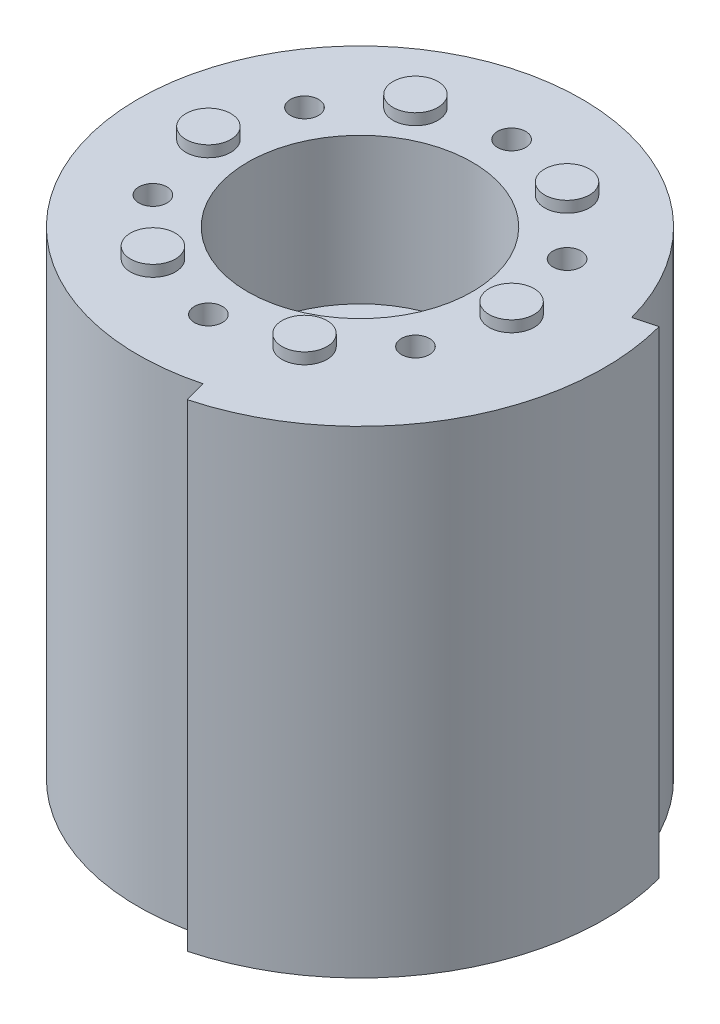
ISO-10303-21;
HEADER;
FILE_DESCRIPTION(('STEP AP214'),'2;1');
FILE_NAME('part.step','',(''),(''),'','','');
FILE_SCHEMA(('AUTOMOTIVE_DESIGN { 1 0 10303 214 1 1 1 1 }'));
ENDSEC;
DATA;
#1=APPLICATION_CONTEXT('core data for automotive mechanical design processes');
#2=APPLICATION_PROTOCOL_DEFINITION('international standard','automotive_design',2000,#1);
#3=PRODUCT_CONTEXT('',#1,'mechanical');
#4=PRODUCT('Part','Part','',(#3));
#5=PRODUCT_RELATED_PRODUCT_CATEGORY('part','',(#4));
#6=PRODUCT_DEFINITION_FORMATION('','',#4);
#7=PRODUCT_DEFINITION_CONTEXT('part definition',#1,'design');
#8=PRODUCT_DEFINITION('design','',#6,#7);
#9=PRODUCT_DEFINITION_SHAPE('','',#8);
#10=(LENGTH_UNIT() NAMED_UNIT(*) SI_UNIT(.MILLI.,.METRE.));
#11=(NAMED_UNIT(*) PLANE_ANGLE_UNIT() SI_UNIT($,.RADIAN.));
#12=(NAMED_UNIT(*) SI_UNIT($,.STERADIAN.) SOLID_ANGLE_UNIT());
#13=UNCERTAINTY_MEASURE_WITH_UNIT(LENGTH_MEASURE(1.E-05),#10,'distance_accuracy_value','');
#14=(GEOMETRIC_REPRESENTATION_CONTEXT(3) GLOBAL_UNCERTAINTY_ASSIGNED_CONTEXT((#13)) GLOBAL_UNIT_ASSIGNED_CONTEXT((#10,
#11,#12)) REPRESENTATION_CONTEXT('',''));
#15=CARTESIAN_POINT('',(0.,0.,0.));
#16=DIRECTION('',(0.,0.,1.));
#17=DIRECTION('',(1.,0.,0.));
#18=AXIS2_PLACEMENT_3D('',#15,#16,#17);
#19=CARTESIAN_POINT('',(0.,1.,0.));
#20=DIRECTION('',(0.,-1.,0.));
#21=DIRECTION('',(0.,0.,-1.));
#22=AXIS2_PLACEMENT_3D('',#19,#20,#21);
#23=CYLINDRICAL_SURFACE('',#22,18.75);
#24=CARTESIAN_POINT('',(0.,1.,0.));
#25=DIRECTION('',(0.,1.,0.));
#26=DIRECTION('',(0.,0.,1.));
#27=AXIS2_PLACEMENT_3D('',#24,#25,#26);
#28=CIRCLE('',#27,18.75);
#29=CARTESIAN_POINT('',(0.,1.,18.75));
#30=VERTEX_POINT('',#29);
#31=EDGE_CURVE('E248',#30,#30,#28,.T.);
#32=ORIENTED_EDGE('',*,*,#31,.T.);
#33=EDGE_LOOP('',(#32));
#34=FACE_BOUND('',#33,.T.);
#35=CARTESIAN_POINT('',(0.,0.25,0.));
#36=DIRECTION('',(0.,-1.,0.));
#37=DIRECTION('',(0.,0.,-1.));
#38=AXIS2_PLACEMENT_3D('',#35,#36,#37);
#39=CIRCLE('',#38,18.75);
#40=CARTESIAN_POINT('',(0.,0.25,-18.75));
#41=VERTEX_POINT('',#40);
#42=EDGE_CURVE('E456',#41,#41,#39,.T.);
#43=ORIENTED_EDGE('',*,*,#42,.T.);
#44=EDGE_LOOP('',(#43));
#45=FACE_BOUND('',#44,.T.);
#46=ADVANCED_FACE('F50',(#34,#45),#23,.F.);
#47=CARTESIAN_POINT('',(-5.99999999999991,0.,10.3923048454133));
#48=DIRECTION('',(0.,1.,0.));
#49=DIRECTION('',(0.,0.,1.));
#50=AXIS2_PLACEMENT_3D('',#47,#48,#49);
#51=CYLINDRICAL_SURFACE('',#50,2.);
#52=CARTESIAN_POINT('',(-5.99999999999991,1.,10.3923048454133));
#53=DIRECTION('',(0.,1.,0.));
#54=DIRECTION('',(0.,0.,1.));
#55=AXIS2_PLACEMENT_3D('',#52,#53,#54);
#56=CIRCLE('',#55,2.);
#57=CARTESIAN_POINT('',(-5.99999999999991,1.,12.3923048454133));
#58=VERTEX_POINT('',#57);
#59=EDGE_CURVE('E254',#58,#58,#56,.F.);
#60=ORIENTED_EDGE('',*,*,#59,.T.);
#61=EDGE_LOOP('',(#60));
#62=FACE_BOUND('',#61,.T.);
#63=CARTESIAN_POINT('',(-5.99999999999991,0.25,10.3923048454133));
#64=DIRECTION('',(0.,-1.,0.));
#65=DIRECTION('',(0.,0.,-1.));
#66=AXIS2_PLACEMENT_3D('',#63,#64,#65);
#67=CIRCLE('',#66,2.);
#68=CARTESIAN_POINT('',(-5.99999999999991,0.25,8.39230484541332));
#69=VERTEX_POINT('',#68);
#70=EDGE_CURVE('E463',#69,#69,#67,.T.);
#71=ORIENTED_EDGE('',*,*,#70,.F.);
#72=EDGE_LOOP('',(#71));
#73=FACE_BOUND('',#72,.T.);
#74=ADVANCED_FACE('F299',(#62,#73),#51,.T.);
#75=CARTESIAN_POINT('',(-6.00000000000005,0.,-10.3923048454132));
#76=DIRECTION('',(0.,1.,0.));
#77=DIRECTION('',(0.,0.,1.));
#78=AXIS2_PLACEMENT_3D('',#75,#76,#77);
#79=CYLINDRICAL_SURFACE('',#78,2.);
#80=CARTESIAN_POINT('',(-6.00000000000005,1.,-10.3923048454132));
#81=DIRECTION('',(0.,1.,0.));
#82=DIRECTION('',(0.,0.,1.));
#83=AXIS2_PLACEMENT_3D('',#80,#81,#82);
#84=CIRCLE('',#83,2.);
#85=CARTESIAN_POINT('',(-6.00000000000005,1.,-8.39230484541324));
#86=VERTEX_POINT('',#85);
#87=EDGE_CURVE('E256',#86,#86,#84,.F.);
#88=ORIENTED_EDGE('',*,*,#87,.T.);
#89=EDGE_LOOP('',(#88));
#90=FACE_BOUND('',#89,.T.);
#91=CARTESIAN_POINT('',(-6.00000000000005,0.25,-10.3923048454132));
#92=DIRECTION('',(0.,-1.,0.));
#93=DIRECTION('',(0.,0.,-1.));
#94=AXIS2_PLACEMENT_3D('',#91,#92,#93);
#95=CIRCLE('',#94,2.);
#96=CARTESIAN_POINT('',(-6.00000000000005,0.25,-12.3923048454132));
#97=VERTEX_POINT('',#96);
#98=EDGE_CURVE('E474',#97,#97,#95,.T.);
#99=ORIENTED_EDGE('',*,*,#98,.F.);
#100=EDGE_LOOP('',(#99));
#101=FACE_BOUND('',#100,.T.);
#102=ADVANCED_FACE('F304',(#90,#101),#79,.T.);
#103=CARTESIAN_POINT('',(12.,0.,0.));
#104=DIRECTION('',(0.,1.,0.));
#105=DIRECTION('',(0.,0.,1.));
#106=AXIS2_PLACEMENT_3D('',#103,#104,#105);
#107=CYLINDRICAL_SURFACE('',#106,2.);
#108=CARTESIAN_POINT('',(12.,1.,0.));
#109=DIRECTION('',(0.,1.,0.));
#110=DIRECTION('',(0.,0.,1.));
#111=AXIS2_PLACEMENT_3D('',#108,#109,#110);
#112=CIRCLE('',#111,2.);
#113=CARTESIAN_POINT('',(12.,1.,2.));
#114=VERTEX_POINT('',#113);
#115=EDGE_CURVE('E57',#114,#114,#112,.F.);
#116=ORIENTED_EDGE('',*,*,#115,.T.);
#117=EDGE_LOOP('',(#116));
#118=FACE_BOUND('',#117,.T.);
#119=CARTESIAN_POINT('',(12.,0.25,0.));
#120=DIRECTION('',(0.,-1.,0.));
#121=DIRECTION('',(0.,0.,-1.));
#122=AXIS2_PLACEMENT_3D('',#119,#120,#121);
#123=CIRCLE('',#122,2.);
#124=CARTESIAN_POINT('',(12.,0.25,-2.));
#125=VERTEX_POINT('',#124);
#126=EDGE_CURVE('E472',#125,#125,#123,.T.);
#127=ORIENTED_EDGE('',*,*,#126,.F.);
#128=EDGE_LOOP('',(#127));
#129=FACE_BOUND('',#128,.T.);
#130=ADVANCED_FACE('F262',(#118,#129),#107,.T.);
#131=CARTESIAN_POINT('',(0.,1.,0.));
#132=DIRECTION('',(0.,1.,0.));
#133=DIRECTION('',(0.,0.,1.));
#134=AXIS2_PLACEMENT_3D('',#131,#132,#133);
#135=PLANE('',#134);
#136=CARTESIAN_POINT('',(-13.5,1.,0.));
#137=DIRECTION('',(0.,-1.,0.));
#138=DIRECTION('',(0.,0.,-1.));
#139=AXIS2_PLACEMENT_3D('',#136,#137,#138);
#140=CIRCLE('',#139,3.);
#141=CARTESIAN_POINT('',(-13.5,1.,-3.));
#142=VERTEX_POINT('',#141);
#143=EDGE_CURVE('E125',#142,#142,#140,.T.);
#144=ORIENTED_EDGE('',*,*,#143,.F.);
#145=EDGE_LOOP('',(#144));
#146=FACE_BOUND('',#145,.T.);
#147=CARTESIAN_POINT('',(6.75000000000005,1.,11.6913429510899));
#148=DIRECTION('',(0.,-1.,0.));
#149=DIRECTION('',(0.,0.,-1.));
#150=AXIS2_PLACEMENT_3D('',#147,#148,#149);
#151=CIRCLE('',#150,3.);
#152=CARTESIAN_POINT('',(6.75000000000005,1.,8.69134295108989));
#153=VERTEX_POINT('',#152);
#154=EDGE_CURVE('E129',#153,#153,#151,.T.);
#155=ORIENTED_EDGE('',*,*,#154,.F.);
#156=EDGE_LOOP('',(#155));
#157=FACE_BOUND('',#156,.T.);
#158=ORIENTED_EDGE('',*,*,#115,.F.);
#159=EDGE_LOOP('',(#158));
#160=FACE_BOUND('',#159,.T.);
#161=ORIENTED_EDGE('',*,*,#87,.F.);
#162=EDGE_LOOP('',(#161));
#163=FACE_BOUND('',#162,.T.);
#164=ORIENTED_EDGE('',*,*,#59,.F.);
#165=EDGE_LOOP('',(#164));
#166=FACE_BOUND('',#165,.T.);
#167=ORIENTED_EDGE('',*,*,#31,.F.);
#168=EDGE_LOOP('',(#167));
#169=FACE_BOUND('',#168,.T.);
#170=CARTESIAN_POINT('',(6.74999999999989,1.,-11.69134295109));
#171=DIRECTION('',(0.,-1.,0.));
#172=DIRECTION('',(0.,0.,-1.));
#173=AXIS2_PLACEMENT_3D('',#170,#171,#172);
#174=CIRCLE('',#173,3.);
#175=CARTESIAN_POINT('',(6.74999999999989,1.,-14.69134295109));
#176=VERTEX_POINT('',#175);
#177=EDGE_CURVE('E132',#176,#176,#174,.T.);
#178=ORIENTED_EDGE('',*,*,#177,.F.);
#179=EDGE_LOOP('',(#178));
#180=FACE_BOUND('',#179,.T.);
#181=ADVANCED_FACE('F270',(#146,#157,#160,#163,#166,#169,#180),#135,.F.);
#182=CARTESIAN_POINT('',(6.75000000000005,7.,11.6913429510899));
#183=DIRECTION('',(0.,-1.,0.));
#184=DIRECTION('',(0.,0.,-1.));
#185=AXIS2_PLACEMENT_3D('',#182,#183,#184);
#186=CYLINDRICAL_SURFACE('',#185,3.);
#187=CARTESIAN_POINT('',(6.75000000000005,7.,11.6913429510899));
#188=DIRECTION('',(0.,-1.,0.));
#189=DIRECTION('',(0.,0.,-1.));
#190=AXIS2_PLACEMENT_3D('',#187,#188,#189);
#191=CIRCLE('',#190,3.);
#192=CARTESIAN_POINT('',(6.75000000000005,7.,8.69134295108989));
#193=VERTEX_POINT('',#192);
#194=EDGE_CURVE('E127',#193,#193,#191,.T.);
#195=ORIENTED_EDGE('',*,*,#194,.F.);
#196=EDGE_LOOP('',(#195));
#197=FACE_BOUND('',#196,.T.);
#198=ORIENTED_EDGE('',*,*,#154,.T.);
#199=EDGE_LOOP('',(#198));
#200=FACE_BOUND('',#199,.T.);
#201=ADVANCED_FACE('F269',(#197,#200),#186,.F.);
#202=CARTESIAN_POINT('',(6.75000000000005,7.,11.6913429510899));
#203=DIRECTION('',(0.,-1.,0.));
#204=DIRECTION('',(0.,0.,-1.));
#205=AXIS2_PLACEMENT_3D('',#202,#203,#204);
#206=PLANE('',#205);
#207=ORIENTED_EDGE('',*,*,#194,.T.);
#208=EDGE_LOOP('',(#207));
#209=FACE_BOUND('',#208,.T.);
#210=ADVANCED_FACE('F492',(#209),#206,.T.);
#211=CARTESIAN_POINT('',(-13.5,7.,0.));
#212=DIRECTION('',(0.,-1.,0.));
#213=DIRECTION('',(0.,0.,-1.));
#214=AXIS2_PLACEMENT_3D('',#211,#212,#213);
#215=CYLINDRICAL_SURFACE('',#214,3.);
#216=CARTESIAN_POINT('',(-13.5,7.,0.));
#217=DIRECTION('',(0.,-1.,0.));
#218=DIRECTION('',(0.,0.,-1.));
#219=AXIS2_PLACEMENT_3D('',#216,#217,#218);
#220=CIRCLE('',#219,3.);
#221=CARTESIAN_POINT('',(-13.5,7.,-3.));
#222=VERTEX_POINT('',#221);
#223=EDGE_CURVE('E120',#222,#222,#220,.T.);
#224=ORIENTED_EDGE('',*,*,#223,.F.);
#225=EDGE_LOOP('',(#224));
#226=FACE_BOUND('',#225,.T.);
#227=ORIENTED_EDGE('',*,*,#143,.T.);
#228=EDGE_LOOP('',(#227));
#229=FACE_BOUND('',#228,.T.);
#230=ADVANCED_FACE('F291',(#226,#229),#215,.F.);
#231=CARTESIAN_POINT('',(-13.5,7.,0.));
#232=DIRECTION('',(0.,-1.,0.));
#233=DIRECTION('',(0.,0.,-1.));
#234=AXIS2_PLACEMENT_3D('',#231,#232,#233);
#235=PLANE('',#234);
#236=ORIENTED_EDGE('',*,*,#223,.T.);
#237=EDGE_LOOP('',(#236));
#238=FACE_BOUND('',#237,.T.);
#239=ADVANCED_FACE('F282',(#238),#235,.T.);
#240=CARTESIAN_POINT('',(6.74999999999989,7.,-11.69134295109));
#241=DIRECTION('',(0.,-1.,0.));
#242=DIRECTION('',(0.,0.,-1.));
#243=AXIS2_PLACEMENT_3D('',#240,#241,#242);
#244=CYLINDRICAL_SURFACE('',#243,3.);
#245=CARTESIAN_POINT('',(6.74999999999989,7.,-11.69134295109));
#246=DIRECTION('',(0.,-1.,0.));
#247=DIRECTION('',(0.,0.,-1.));
#248=AXIS2_PLACEMENT_3D('',#245,#246,#247);
#249=CIRCLE('',#248,3.);
#250=CARTESIAN_POINT('',(6.74999999999989,7.,-14.69134295109));
#251=VERTEX_POINT('',#250);
#252=EDGE_CURVE('E137',#251,#251,#249,.T.);
#253=ORIENTED_EDGE('',*,*,#252,.F.);
#254=EDGE_LOOP('',(#253));
#255=FACE_BOUND('',#254,.T.);
#256=ORIENTED_EDGE('',*,*,#177,.T.);
#257=EDGE_LOOP('',(#256));
#258=FACE_BOUND('',#257,.T.);
#259=ADVANCED_FACE('F283',(#255,#258),#244,.F.);
#260=CARTESIAN_POINT('',(6.74999999999989,7.,-11.69134295109));
#261=DIRECTION('',(0.,-1.,0.));
#262=DIRECTION('',(0.,0.,-1.));
#263=AXIS2_PLACEMENT_3D('',#260,#261,#262);
#264=PLANE('',#263);
#265=ORIENTED_EDGE('',*,*,#252,.T.);
#266=EDGE_LOOP('',(#265));
#267=FACE_BOUND('',#266,.T.);
#268=ADVANCED_FACE('F281',(#267),#264,.T.);
#269=CARTESIAN_POINT('',(0.,0.25,0.));
#270=DIRECTION('',(0.,-1.,0.));
#271=DIRECTION('',(0.,0.,-1.));
#272=AXIS2_PLACEMENT_3D('',#269,#270,#271);
#273=PLANE('',#272);
#274=ORIENTED_EDGE('',*,*,#42,.F.);
#275=EDGE_LOOP('',(#274));
#276=FACE_BOUND('',#275,.T.);
#277=CARTESIAN_POINT('',(0.,0.25,0.));
#278=DIRECTION('',(0.,-1.,0.));
#279=DIRECTION('',(0.,0.,-1.));
#280=AXIS2_PLACEMENT_3D('',#277,#278,#279);
#281=CIRCLE('',#280,19.75);
#282=CARTESIAN_POINT('',(5.11167614077473,0.25,19.0770350692091));
#283=VERTEX_POINT('',#282);
#284=CARTESIAN_POINT('',(19.0770350692091,0.25,-5.11167614077466));
#285=VERTEX_POINT('',#284);
#286=EDGE_CURVE('E103',#283,#285,#281,.T.);
#287=ORIENTED_EDGE('',*,*,#286,.T.);
#288=DIRECTION('',(-0.96592582628907,0.,0.258819045102515));
#289=VECTOR('',#288,1.);
#290=CARTESIAN_POINT('',(0.,0.25,0.));
#291=LINE('',#290,#289);
#292=CARTESIAN_POINT('',(21.0088867217873,0.249999999999986,-5.62931423097969));
#293=VERTEX_POINT('',#292);
#294=EDGE_CURVE('E65',#293,#285,#291,.T.);
#295=ORIENTED_EDGE('',*,*,#294,.F.);
#296=CARTESIAN_POINT('',(0.,0.25,0.));
#297=DIRECTION('',(0.,-1.,0.));
#298=DIRECTION('',(0.,0.,-1.));
#299=AXIS2_PLACEMENT_3D('',#296,#297,#298);
#300=CIRCLE('',#299,21.75);
#301=CARTESIAN_POINT('',(5.62931423097977,0.25,21.0088867217872));
#302=VERTEX_POINT('',#301);
#303=EDGE_CURVE('E11',#302,#293,#300,.F.);
#304=ORIENTED_EDGE('',*,*,#303,.F.);
#305=DIRECTION('',(0.258819045102518,0.,0.965925826289069));
#306=VECTOR('',#305,1.);
#307=CARTESIAN_POINT('',(0.,0.25,0.));
#308=LINE('',#307,#306);
#309=EDGE_CURVE('E86',#283,#302,#308,.T.);
#310=ORIENTED_EDGE('',*,*,#309,.F.);
#311=EDGE_LOOP('',(#287,#295,#304,#310));
#312=FACE_BOUND('',#311,.T.);
#313=ADVANCED_FACE('F90',(#276,#312),#273,.T.);
#314=ORIENTED_EDGE('',*,*,#126,.T.);
#315=EDGE_LOOP('',(#314));
#316=FACE_BOUND('',#315,.T.);
#317=ADVANCED_FACE('F592',(#316),#273,.T.);
#318=ORIENTED_EDGE('',*,*,#98,.T.);
#319=EDGE_LOOP('',(#318));
#320=FACE_BOUND('',#319,.T.);
#321=ADVANCED_FACE('F601',(#320),#273,.T.);
#322=ORIENTED_EDGE('',*,*,#70,.T.);
#323=EDGE_LOOP('',(#322));
#324=FACE_BOUND('',#323,.T.);
#325=ADVANCED_FACE('F323',(#324),#273,.T.);
#326=CARTESIAN_POINT('',(0.,29.8,0.));
#327=DIRECTION('',(0.,1.,0.));
#328=DIRECTION('',(0.,0.,1.));
#329=AXIS2_PLACEMENT_3D('',#326,#327,#328);
#330=PLANE('',#329);
#331=CARTESIAN_POINT('',(0.,29.8,0.));
#332=DIRECTION('',(0.,1.,0.));
#333=DIRECTION('',(0.,0.,1.));
#334=AXIS2_PLACEMENT_3D('',#331,#332,#333);
#335=CIRCLE('',#334,10.);
#336=CARTESIAN_POINT('',(0.,29.8,10.));
#337=VERTEX_POINT('',#336);
#338=EDGE_CURVE('E238',#337,#337,#335,.T.);
#339=ORIENTED_EDGE('',*,*,#338,.T.);
#340=EDGE_LOOP('',(#339));
#341=FACE_BOUND('',#340,.T.);
#342=ADVANCED_FACE('F318',(#341),#330,.T.);
#343=CARTESIAN_POINT('',(0.,29.8,-13.5));
#344=DIRECTION('',(0.,1.,0.));
#345=DIRECTION('',(0.,0.,1.));
#346=AXIS2_PLACEMENT_3D('',#343,#344,#345);
#347=PLANE('',#346);
#348=CARTESIAN_POINT('',(0.,29.8,-13.5));
#349=DIRECTION('',(0.,1.,0.));
#350=DIRECTION('',(0.,0.,1.));
#351=AXIS2_PLACEMENT_3D('',#348,#349,#350);
#352=CIRCLE('',#351,1.25);
#353=CARTESIAN_POINT('',(0.,29.8,-12.25));
#354=VERTEX_POINT('',#353);
#355=EDGE_CURVE('E192',#354,#354,#352,.T.);
#356=ORIENTED_EDGE('',*,*,#355,.T.);
#357=EDGE_LOOP('',(#356));
#358=FACE_BOUND('',#357,.T.);
#359=ADVANCED_FACE('F325',(#358),#347,.T.);
#360=CARTESIAN_POINT('',(11.6913429510899,29.8,-6.75000000000001));
#361=DIRECTION('',(0.,1.,0.));
#362=DIRECTION('',(0.,0.,1.));
#363=AXIS2_PLACEMENT_3D('',#360,#361,#362);
#364=PLANE('',#363);
#365=CARTESIAN_POINT('',(11.6913429510899,29.8,-6.75000000000001));
#366=DIRECTION('',(0.,1.,0.));
#367=DIRECTION('',(0.,0.,1.));
#368=AXIS2_PLACEMENT_3D('',#365,#366,#367);
#369=CIRCLE('',#368,1.25);
#370=CARTESIAN_POINT('',(11.6913429510899,29.8,-5.50000000000001));
#371=VERTEX_POINT('',#370);
#372=EDGE_CURVE('E202',#371,#371,#369,.T.);
#373=ORIENTED_EDGE('',*,*,#372,.T.);
#374=EDGE_LOOP('',(#373));
#375=FACE_BOUND('',#374,.T.);
#376=ADVANCED_FACE('F358',(#375),#364,.T.);
#377=CARTESIAN_POINT('',(11.6913429510899,29.8,6.75));
#378=DIRECTION('',(0.,1.,0.));
#379=DIRECTION('',(0.,0.,1.));
#380=AXIS2_PLACEMENT_3D('',#377,#378,#379);
#381=PLANE('',#380);
#382=CARTESIAN_POINT('',(11.6913429510899,29.8,6.75));
#383=DIRECTION('',(0.,1.,0.));
#384=DIRECTION('',(0.,0.,1.));
#385=AXIS2_PLACEMENT_3D('',#382,#383,#384);
#386=CIRCLE('',#385,1.25);
#387=CARTESIAN_POINT('',(11.6913429510899,29.8,8.));
#388=VERTEX_POINT('',#387);
#389=EDGE_CURVE('E214',#388,#388,#386,.T.);
#390=ORIENTED_EDGE('',*,*,#389,.T.);
#391=EDGE_LOOP('',(#390));
#392=FACE_BOUND('',#391,.T.);
#393=ADVANCED_FACE('F346',(#392),#381,.T.);
#394=CARTESIAN_POINT('',(0.,29.8,13.5));
#395=DIRECTION('',(0.,1.,0.));
#396=DIRECTION('',(0.,0.,1.));
#397=AXIS2_PLACEMENT_3D('',#394,#395,#396);
#398=PLANE('',#397);
#399=CARTESIAN_POINT('',(0.,29.8,13.5));
#400=DIRECTION('',(0.,1.,0.));
#401=DIRECTION('',(0.,0.,1.));
#402=AXIS2_PLACEMENT_3D('',#399,#400,#401);
#403=CIRCLE('',#402,1.25);
#404=CARTESIAN_POINT('',(0.,29.8,14.75));
#405=VERTEX_POINT('',#404);
#406=EDGE_CURVE('E217',#405,#405,#403,.T.);
#407=ORIENTED_EDGE('',*,*,#406,.T.);
#408=EDGE_LOOP('',(#407));
#409=FACE_BOUND('',#408,.T.);
#410=ADVANCED_FACE('F338',(#409),#398,.T.);
#411=CARTESIAN_POINT('',(-11.6913429510899,29.8,6.75000000000001));
#412=DIRECTION('',(0.,1.,0.));
#413=DIRECTION('',(0.,0.,1.));
#414=AXIS2_PLACEMENT_3D('',#411,#412,#413);
#415=PLANE('',#414);
#416=CARTESIAN_POINT('',(-11.6913429510899,29.8,6.75000000000001));
#417=DIRECTION('',(0.,1.,0.));
#418=DIRECTION('',(0.,0.,1.));
#419=AXIS2_PLACEMENT_3D('',#416,#417,#418);
#420=CIRCLE('',#419,1.25);
#421=CARTESIAN_POINT('',(-11.6913429510899,29.8,8.00000000000001));
#422=VERTEX_POINT('',#421);
#423=EDGE_CURVE('E227',#422,#422,#420,.T.);
#424=ORIENTED_EDGE('',*,*,#423,.T.);
#425=EDGE_LOOP('',(#424));
#426=FACE_BOUND('',#425,.T.);
#427=ADVANCED_FACE('F329',(#426),#415,.T.);
#428=CARTESIAN_POINT('',(-11.6913429510899,29.8,-6.74999999999999));
#429=DIRECTION('',(0.,1.,0.));
#430=DIRECTION('',(0.,0.,1.));
#431=AXIS2_PLACEMENT_3D('',#428,#429,#430);
#432=PLANE('',#431);
#433=CARTESIAN_POINT('',(-11.6913429510899,29.8,-6.74999999999999));
#434=DIRECTION('',(0.,1.,0.));
#435=DIRECTION('',(0.,0.,1.));
#436=AXIS2_PLACEMENT_3D('',#433,#434,#435);
#437=CIRCLE('',#436,1.25);
#438=CARTESIAN_POINT('',(-11.6913429510899,29.8,-5.49999999999999));
#439=VERTEX_POINT('',#438);
#440=EDGE_CURVE('E149',#439,#439,#437,.T.);
#441=ORIENTED_EDGE('',*,*,#440,.T.);
#442=EDGE_LOOP('',(#441));
#443=FACE_BOUND('',#442,.T.);
#444=ADVANCED_FACE('F328',(#443),#432,.T.);
#445=CARTESIAN_POINT('',(6.74999999999997,43.8,11.6913429510899));
#446=DIRECTION('',(0.,1.,0.));
#447=DIRECTION('',(0.,0.,1.));
#448=AXIS2_PLACEMENT_3D('',#445,#446,#447);
#449=PLANE('',#448);
#450=CARTESIAN_POINT('',(6.74999999999997,43.8,11.6913429510899));
#451=DIRECTION('',(0.,1.,0.));
#452=DIRECTION('',(0.,0.,1.));
#453=AXIS2_PLACEMENT_3D('',#450,#451,#452);
#454=CIRCLE('',#453,2.);
#455=CARTESIAN_POINT('',(6.74999999999997,43.8,13.6913429510899));
#456=VERTEX_POINT('',#455);
#457=EDGE_CURVE('E161',#456,#456,#454,.T.);
#458=ORIENTED_EDGE('',*,*,#457,.T.);
#459=EDGE_LOOP('',(#458));
#460=FACE_BOUND('',#459,.T.);
#461=ADVANCED_FACE('F327',(#460),#449,.T.);
#462=CARTESIAN_POINT('',(-6.75000000000005,43.8,11.6913429510899));
#463=DIRECTION('',(0.,1.,0.));
#464=DIRECTION('',(0.,0.,1.));
#465=AXIS2_PLACEMENT_3D('',#462,#463,#464);
#466=PLANE('',#465);
#467=CARTESIAN_POINT('',(-6.75000000000005,43.8,11.6913429510899));
#468=DIRECTION('',(0.,1.,0.));
#469=DIRECTION('',(0.,0.,1.));
#470=AXIS2_PLACEMENT_3D('',#467,#468,#469);
#471=CIRCLE('',#470,2.);
#472=CARTESIAN_POINT('',(-6.75000000000005,43.8,13.6913429510899));
#473=VERTEX_POINT('',#472);
#474=EDGE_CURVE('E171',#473,#473,#471,.T.);
#475=ORIENTED_EDGE('',*,*,#474,.T.);
#476=EDGE_LOOP('',(#475));
#477=FACE_BOUND('',#476,.T.);
#478=ADVANCED_FACE('F391',(#477),#466,.T.);
#479=CARTESIAN_POINT('',(-13.5,43.8,0.));
#480=DIRECTION('',(0.,1.,0.));
#481=DIRECTION('',(0.,0.,1.));
#482=AXIS2_PLACEMENT_3D('',#479,#480,#481);
#483=PLANE('',#482);
#484=CARTESIAN_POINT('',(-13.5,43.8,0.));
#485=DIRECTION('',(0.,1.,0.));
#486=DIRECTION('',(0.,0.,1.));
#487=AXIS2_PLACEMENT_3D('',#484,#485,#486);
#488=CIRCLE('',#487,2.);
#489=CARTESIAN_POINT('',(-13.5,43.8,1.9999999999999));
#490=VERTEX_POINT('',#489);
#491=EDGE_CURVE('E177',#490,#490,#488,.T.);
#492=ORIENTED_EDGE('',*,*,#491,.T.);
#493=EDGE_LOOP('',(#492));
#494=FACE_BOUND('',#493,.T.);
#495=ADVANCED_FACE('F384',(#494),#483,.T.);
#496=CARTESIAN_POINT('',(-6.74999999999989,43.8,-11.69134295109));
#497=DIRECTION('',(0.,1.,0.));
#498=DIRECTION('',(0.,0.,1.));
#499=AXIS2_PLACEMENT_3D('',#496,#497,#498);
#500=PLANE('',#499);
#501=CARTESIAN_POINT('',(-6.74999999999989,43.8,-11.69134295109));
#502=DIRECTION('',(0.,1.,0.));
#503=DIRECTION('',(0.,0.,1.));
#504=AXIS2_PLACEMENT_3D('',#501,#502,#503);
#505=CIRCLE('',#504,2.);
#506=CARTESIAN_POINT('',(-6.74999999999989,43.8,-9.69134295108998));
#507=VERTEX_POINT('',#506);
#508=EDGE_CURVE('E156',#507,#507,#505,.T.);
#509=ORIENTED_EDGE('',*,*,#508,.T.);
#510=EDGE_LOOP('',(#509));
#511=FACE_BOUND('',#510,.T.);
#512=ADVANCED_FACE('F378',(#511),#500,.T.);
#513=CARTESIAN_POINT('',(6.75000000000014,43.8,-11.6913429510898));
#514=DIRECTION('',(0.,1.,0.));
#515=DIRECTION('',(0.,0.,1.));
#516=AXIS2_PLACEMENT_3D('',#513,#514,#515);
#517=PLANE('',#516);
#518=CARTESIAN_POINT('',(6.75000000000014,43.8,-11.6913429510898));
#519=DIRECTION('',(0.,1.,0.));
#520=DIRECTION('',(0.,0.,1.));
#521=AXIS2_PLACEMENT_3D('',#518,#519,#520);
#522=CIRCLE('',#521,2.);
#523=CARTESIAN_POINT('',(6.75000000000014,43.8,-9.69134295108984));
#524=VERTEX_POINT('',#523);
#525=EDGE_CURVE('E122',#524,#524,#522,.T.);
#526=ORIENTED_EDGE('',*,*,#525,.T.);
#527=EDGE_LOOP('',(#526));
#528=FACE_BOUND('',#527,.T.);
#529=ADVANCED_FACE('F385',(#528),#517,.T.);
#530=CARTESIAN_POINT('',(13.5,43.8,0.));
#531=DIRECTION('',(0.,1.,0.));
#532=DIRECTION('',(0.,0.,1.));
#533=AXIS2_PLACEMENT_3D('',#530,#531,#532);
#534=PLANE('',#533);
#535=CARTESIAN_POINT('',(13.5,43.8,0.));
#536=DIRECTION('',(0.,1.,0.));
#537=DIRECTION('',(0.,0.,1.));
#538=AXIS2_PLACEMENT_3D('',#535,#536,#537);
#539=CIRCLE('',#538,2.);
#540=CARTESIAN_POINT('',(13.5,43.8,2.));
#541=VERTEX_POINT('',#540);
#542=EDGE_CURVE('E145',#541,#541,#539,.T.);
#543=ORIENTED_EDGE('',*,*,#542,.T.);
#544=EDGE_LOOP('',(#543));
#545=FACE_BOUND('',#544,.T.);
#546=ADVANCED_FACE('F319',(#545),#534,.T.);
#547=CARTESIAN_POINT('',(0.,29.8,0.));
#548=DIRECTION('',(0.,1.,0.));
#549=DIRECTION('',(0.,0.,1.));
#550=AXIS2_PLACEMENT_3D('',#547,#548,#549);
#551=CYLINDRICAL_SURFACE('',#550,10.);
#552=ORIENTED_EDGE('',*,*,#338,.F.);
#553=EDGE_LOOP('',(#552));
#554=FACE_BOUND('',#553,.T.);
#555=CARTESIAN_POINT('',(0.,42.8,0.));
#556=DIRECTION('',(0.,1.,0.));
#557=DIRECTION('',(0.,0.,1.));
#558=AXIS2_PLACEMENT_3D('',#555,#556,#557);
#559=CIRCLE('',#558,10.);
#560=CARTESIAN_POINT('',(0.,42.8,10.));
#561=VERTEX_POINT('',#560);
#562=EDGE_CURVE('E193',#561,#561,#559,.T.);
#563=ORIENTED_EDGE('',*,*,#562,.T.);
#564=EDGE_LOOP('',(#563));
#565=FACE_BOUND('',#564,.T.);
#566=ADVANCED_FACE('F313',(#554,#565),#551,.F.);
#567=CARTESIAN_POINT('',(0.,29.8,-13.5));
#568=DIRECTION('',(0.,1.,0.));
#569=DIRECTION('',(0.,0.,1.));
#570=AXIS2_PLACEMENT_3D('',#567,#568,#569);
#571=CYLINDRICAL_SURFACE('',#570,1.25);
#572=ORIENTED_EDGE('',*,*,#355,.F.);
#573=EDGE_LOOP('',(#572));
#574=FACE_BOUND('',#573,.T.);
#575=CARTESIAN_POINT('',(0.,42.8,-13.5));
#576=DIRECTION('',(0.,1.,0.));
#577=DIRECTION('',(0.,0.,1.));
#578=AXIS2_PLACEMENT_3D('',#575,#576,#577);
#579=CIRCLE('',#578,1.25);
#580=CARTESIAN_POINT('',(0.,42.8,-12.25));
#581=VERTEX_POINT('',#580);
#582=EDGE_CURVE('E188',#581,#581,#579,.T.);
#583=ORIENTED_EDGE('',*,*,#582,.T.);
#584=EDGE_LOOP('',(#583));
#585=FACE_BOUND('',#584,.T.);
#586=ADVANCED_FACE('F320',(#574,#585),#571,.F.);
#587=CARTESIAN_POINT('',(11.6913429510899,29.8,-6.75000000000001));
#588=DIRECTION('',(0.,1.,0.));
#589=DIRECTION('',(0.,0.,1.));
#590=AXIS2_PLACEMENT_3D('',#587,#588,#589);
#591=CYLINDRICAL_SURFACE('',#590,1.25);
#592=ORIENTED_EDGE('',*,*,#372,.F.);
#593=EDGE_LOOP('',(#592));
#594=FACE_BOUND('',#593,.T.);
#595=CARTESIAN_POINT('',(11.6913429510899,42.8,-6.75000000000001));
#596=DIRECTION('',(0.,1.,0.));
#597=DIRECTION('',(0.,0.,1.));
#598=AXIS2_PLACEMENT_3D('',#595,#596,#597);
#599=CIRCLE('',#598,1.25);
#600=CARTESIAN_POINT('',(11.6913429510899,42.8,-5.50000000000001));
#601=VERTEX_POINT('',#600);
#602=EDGE_CURVE('E197',#601,#601,#599,.T.);
#603=ORIENTED_EDGE('',*,*,#602,.T.);
#604=EDGE_LOOP('',(#603));
#605=FACE_BOUND('',#604,.T.);
#606=ADVANCED_FACE('F359',(#594,#605),#591,.F.);
#607=CARTESIAN_POINT('',(11.6913429510899,29.8,6.75));
#608=DIRECTION('',(0.,1.,0.));
#609=DIRECTION('',(0.,0.,1.));
#610=AXIS2_PLACEMENT_3D('',#607,#608,#609);
#611=CYLINDRICAL_SURFACE('',#610,1.25);
#612=ORIENTED_EDGE('',*,*,#389,.F.);
#613=EDGE_LOOP('',(#612));
#614=FACE_BOUND('',#613,.T.);
#615=CARTESIAN_POINT('',(11.6913429510899,42.8,6.75));
#616=DIRECTION('',(0.,1.,0.));
#617=DIRECTION('',(0.,0.,1.));
#618=AXIS2_PLACEMENT_3D('',#615,#616,#617);
#619=CIRCLE('',#618,1.25);
#620=CARTESIAN_POINT('',(11.6913429510899,42.8,8.));
#621=VERTEX_POINT('',#620);
#622=EDGE_CURVE('E210',#621,#621,#619,.T.);
#623=ORIENTED_EDGE('',*,*,#622,.T.);
#624=EDGE_LOOP('',(#623));
#625=FACE_BOUND('',#624,.T.);
#626=ADVANCED_FACE('F355',(#614,#625),#611,.F.);
#627=CARTESIAN_POINT('',(0.,29.8,13.5));
#628=DIRECTION('',(0.,1.,0.));
#629=DIRECTION('',(0.,0.,1.));
#630=AXIS2_PLACEMENT_3D('',#627,#628,#629);
#631=CYLINDRICAL_SURFACE('',#630,1.25);
#632=ORIENTED_EDGE('',*,*,#406,.F.);
#633=EDGE_LOOP('',(#632));
#634=FACE_BOUND('',#633,.T.);
#635=CARTESIAN_POINT('',(0.,42.8,13.5));
#636=DIRECTION('',(0.,1.,0.));
#637=DIRECTION('',(0.,0.,1.));
#638=AXIS2_PLACEMENT_3D('',#635,#636,#637);
#639=CIRCLE('',#638,1.25);
#640=CARTESIAN_POINT('',(0.,42.8,14.75));
#641=VERTEX_POINT('',#640);
#642=EDGE_CURVE('E212',#641,#641,#639,.T.);
#643=ORIENTED_EDGE('',*,*,#642,.T.);
#644=EDGE_LOOP('',(#643));
#645=FACE_BOUND('',#644,.T.);
#646=ADVANCED_FACE('F343',(#634,#645),#631,.F.);
#647=CARTESIAN_POINT('',(-11.6913429510899,29.8,6.75000000000001));
#648=DIRECTION('',(0.,1.,0.));
#649=DIRECTION('',(0.,0.,1.));
#650=AXIS2_PLACEMENT_3D('',#647,#648,#649);
#651=CYLINDRICAL_SURFACE('',#650,1.25);
#652=ORIENTED_EDGE('',*,*,#423,.F.);
#653=EDGE_LOOP('',(#652));
#654=FACE_BOUND('',#653,.T.);
#655=CARTESIAN_POINT('',(-11.6913429510899,42.8,6.75000000000001));
#656=DIRECTION('',(0.,1.,0.));
#657=DIRECTION('',(0.,0.,1.));
#658=AXIS2_PLACEMENT_3D('',#655,#656,#657);
#659=CIRCLE('',#658,1.25);
#660=CARTESIAN_POINT('',(-11.6913429510899,42.8,8.00000000000001));
#661=VERTEX_POINT('',#660);
#662=EDGE_CURVE('E222',#661,#661,#659,.T.);
#663=ORIENTED_EDGE('',*,*,#662,.T.);
#664=EDGE_LOOP('',(#663));
#665=FACE_BOUND('',#664,.T.);
#666=ADVANCED_FACE('F337',(#654,#665),#651,.F.);
#667=CARTESIAN_POINT('',(-11.6913429510899,29.8,-6.74999999999999));
#668=DIRECTION('',(0.,1.,0.));
#669=DIRECTION('',(0.,0.,1.));
#670=AXIS2_PLACEMENT_3D('',#667,#668,#669);
#671=CYLINDRICAL_SURFACE('',#670,1.25);
#672=ORIENTED_EDGE('',*,*,#440,.F.);
#673=EDGE_LOOP('',(#672));
#674=FACE_BOUND('',#673,.T.);
#675=CARTESIAN_POINT('',(-11.6913429510899,42.8,-6.74999999999999));
#676=DIRECTION('',(0.,1.,0.));
#677=DIRECTION('',(0.,0.,1.));
#678=AXIS2_PLACEMENT_3D('',#675,#676,#677);
#679=CIRCLE('',#678,1.25);
#680=CARTESIAN_POINT('',(-11.6913429510899,42.8,-5.49999999999999));
#681=VERTEX_POINT('',#680);
#682=EDGE_CURVE('E233',#681,#681,#679,.T.);
#683=ORIENTED_EDGE('',*,*,#682,.T.);
#684=EDGE_LOOP('',(#683));
#685=FACE_BOUND('',#684,.T.);
#686=ADVANCED_FACE('F335',(#674,#685),#671,.F.);
#687=CARTESIAN_POINT('',(6.74999999999997,43.8,11.6913429510899));
#688=DIRECTION('',(0.,-1.,0.));
#689=DIRECTION('',(0.,0.,-1.));
#690=AXIS2_PLACEMENT_3D('',#687,#688,#689);
#691=CYLINDRICAL_SURFACE('',#690,2.);
#692=ORIENTED_EDGE('',*,*,#457,.F.);
#693=EDGE_LOOP('',(#692));
#694=FACE_BOUND('',#693,.T.);
#695=CARTESIAN_POINT('',(6.74999999999997,42.8,11.6913429510899));
#696=DIRECTION('',(0.,1.,0.));
#697=DIRECTION('',(0.,0.,1.));
#698=AXIS2_PLACEMENT_3D('',#695,#696,#697);
#699=CIRCLE('',#698,2.);
#700=CARTESIAN_POINT('',(6.74999999999997,42.8,13.6913429510899));
#701=VERTEX_POINT('',#700);
#702=EDGE_CURVE('E153',#701,#701,#699,.T.);
#703=ORIENTED_EDGE('',*,*,#702,.T.);
#704=EDGE_LOOP('',(#703));
#705=FACE_BOUND('',#704,.T.);
#706=ADVANCED_FACE('F334',(#694,#705),#691,.T.);
#707=CARTESIAN_POINT('',(-6.75000000000005,43.8,11.6913429510899));
#708=DIRECTION('',(0.,-1.,0.));
#709=DIRECTION('',(0.,0.,-1.));
#710=AXIS2_PLACEMENT_3D('',#707,#708,#709);
#711=CYLINDRICAL_SURFACE('',#710,2.);
#712=ORIENTED_EDGE('',*,*,#474,.F.);
#713=EDGE_LOOP('',(#712));
#714=FACE_BOUND('',#713,.T.);
#715=CARTESIAN_POINT('',(-6.75000000000005,42.8,11.6913429510899));
#716=DIRECTION('',(0.,1.,0.));
#717=DIRECTION('',(0.,0.,1.));
#718=AXIS2_PLACEMENT_3D('',#715,#716,#717);
#719=CIRCLE('',#718,2.);
#720=CARTESIAN_POINT('',(-6.75000000000005,42.8,13.6913429510899));
#721=VERTEX_POINT('',#720);
#722=EDGE_CURVE('E170',#721,#721,#719,.T.);
#723=ORIENTED_EDGE('',*,*,#722,.T.);
#724=EDGE_LOOP('',(#723));
#725=FACE_BOUND('',#724,.T.);
#726=ADVANCED_FACE('F400',(#714,#725),#711,.T.);
#727=CARTESIAN_POINT('',(-13.5,43.8,0.));
#728=DIRECTION('',(0.,-1.,0.));
#729=DIRECTION('',(0.,0.,-1.));
#730=AXIS2_PLACEMENT_3D('',#727,#728,#729);
#731=CYLINDRICAL_SURFACE('',#730,2.);
#732=ORIENTED_EDGE('',*,*,#491,.F.);
#733=EDGE_LOOP('',(#732));
#734=FACE_BOUND('',#733,.T.);
#735=CARTESIAN_POINT('',(-13.5,42.8,0.));
#736=DIRECTION('',(0.,1.,0.));
#737=DIRECTION('',(0.,0.,1.));
#738=AXIS2_PLACEMENT_3D('',#735,#736,#737);
#739=CIRCLE('',#738,2.);
#740=CARTESIAN_POINT('',(-13.5,42.8,1.9999999999999));
#741=VERTEX_POINT('',#740);
#742=EDGE_CURVE('E174',#741,#741,#739,.T.);
#743=ORIENTED_EDGE('',*,*,#742,.T.);
#744=EDGE_LOOP('',(#743));
#745=FACE_BOUND('',#744,.T.);
#746=ADVANCED_FACE('F388',(#734,#745),#731,.T.);
#747=CARTESIAN_POINT('',(-6.74999999999989,43.8,-11.69134295109));
#748=DIRECTION('',(0.,-1.,0.));
#749=DIRECTION('',(0.,0.,-1.));
#750=AXIS2_PLACEMENT_3D('',#747,#748,#749);
#751=CYLINDRICAL_SURFACE('',#750,2.);
#752=ORIENTED_EDGE('',*,*,#508,.F.);
#753=EDGE_LOOP('',(#752));
#754=FACE_BOUND('',#753,.T.);
#755=CARTESIAN_POINT('',(-6.74999999999989,42.8,-11.69134295109));
#756=DIRECTION('',(0.,1.,0.));
#757=DIRECTION('',(0.,0.,1.));
#758=AXIS2_PLACEMENT_3D('',#755,#756,#757);
#759=CIRCLE('',#758,2.);
#760=CARTESIAN_POINT('',(-6.74999999999989,42.8,-9.69134295108998));
#761=VERTEX_POINT('',#760);
#762=EDGE_CURVE('E182',#761,#761,#759,.T.);
#763=ORIENTED_EDGE('',*,*,#762,.T.);
#764=EDGE_LOOP('',(#763));
#765=FACE_BOUND('',#764,.T.);
#766=ADVANCED_FACE('F383',(#754,#765),#751,.T.);
#767=CARTESIAN_POINT('',(6.75000000000014,43.8,-11.6913429510898));
#768=DIRECTION('',(0.,-1.,0.));
#769=DIRECTION('',(0.,0.,-1.));
#770=AXIS2_PLACEMENT_3D('',#767,#768,#769);
#771=CYLINDRICAL_SURFACE('',#770,2.);
#772=ORIENTED_EDGE('',*,*,#525,.F.);
#773=EDGE_LOOP('',(#772));
#774=FACE_BOUND('',#773,.T.);
#775=CARTESIAN_POINT('',(6.75000000000014,42.8,-11.6913429510898));
#776=DIRECTION('',(0.,1.,0.));
#777=DIRECTION('',(0.,0.,1.));
#778=AXIS2_PLACEMENT_3D('',#775,#776,#777);
#779=CIRCLE('',#778,2.);
#780=CARTESIAN_POINT('',(6.75000000000014,42.8,-9.69134295108984));
#781=VERTEX_POINT('',#780);
#782=EDGE_CURVE('E155',#781,#781,#779,.T.);
#783=ORIENTED_EDGE('',*,*,#782,.T.);
#784=EDGE_LOOP('',(#783));
#785=FACE_BOUND('',#784,.T.);
#786=ADVANCED_FACE('F390',(#774,#785),#771,.T.);
#787=CARTESIAN_POINT('',(13.5,43.8,0.));
#788=DIRECTION('',(0.,-1.,0.));
#789=DIRECTION('',(0.,0.,-1.));
#790=AXIS2_PLACEMENT_3D('',#787,#788,#789);
#791=CYLINDRICAL_SURFACE('',#790,2.);
#792=ORIENTED_EDGE('',*,*,#542,.F.);
#793=EDGE_LOOP('',(#792));
#794=FACE_BOUND('',#793,.T.);
#795=CARTESIAN_POINT('',(13.5,42.8,0.));
#796=DIRECTION('',(0.,1.,0.));
#797=DIRECTION('',(0.,0.,1.));
#798=AXIS2_PLACEMENT_3D('',#795,#796,#797);
#799=CIRCLE('',#798,2.);
#800=CARTESIAN_POINT('',(13.5,42.8,2.));
#801=VERTEX_POINT('',#800);
#802=EDGE_CURVE('E146',#801,#801,#799,.T.);
#803=ORIENTED_EDGE('',*,*,#802,.T.);
#804=EDGE_LOOP('',(#803));
#805=FACE_BOUND('',#804,.T.);
#806=ADVANCED_FACE('F315',(#794,#805),#791,.T.);
#807=CARTESIAN_POINT('',(0.,42.8,0.));
#808=DIRECTION('',(0.,1.,0.));
#809=DIRECTION('',(0.,0.,1.));
#810=AXIS2_PLACEMENT_3D('',#807,#808,#809);
#811=PLANE('',#810);
#812=ORIENTED_EDGE('',*,*,#802,.F.);
#813=EDGE_LOOP('',(#812));
#814=FACE_BOUND('',#813,.T.);
#815=ORIENTED_EDGE('',*,*,#782,.F.);
#816=EDGE_LOOP('',(#815));
#817=FACE_BOUND('',#816,.T.);
#818=ORIENTED_EDGE('',*,*,#762,.F.);
#819=EDGE_LOOP('',(#818));
#820=FACE_BOUND('',#819,.T.);
#821=ORIENTED_EDGE('',*,*,#742,.F.);
#822=EDGE_LOOP('',(#821));
#823=FACE_BOUND('',#822,.T.);
#824=ORIENTED_EDGE('',*,*,#722,.F.);
#825=EDGE_LOOP('',(#824));
#826=FACE_BOUND('',#825,.T.);
#827=ORIENTED_EDGE('',*,*,#702,.F.);
#828=EDGE_LOOP('',(#827));
#829=FACE_BOUND('',#828,.T.);
#830=ORIENTED_EDGE('',*,*,#682,.F.);
#831=EDGE_LOOP('',(#830));
#832=FACE_BOUND('',#831,.T.);
#833=ORIENTED_EDGE('',*,*,#662,.F.);
#834=EDGE_LOOP('',(#833));
#835=FACE_BOUND('',#834,.T.);
#836=ORIENTED_EDGE('',*,*,#642,.F.);
#837=EDGE_LOOP('',(#836));
#838=FACE_BOUND('',#837,.T.);
#839=ORIENTED_EDGE('',*,*,#622,.F.);
#840=EDGE_LOOP('',(#839));
#841=FACE_BOUND('',#840,.T.);
#842=ORIENTED_EDGE('',*,*,#602,.F.);
#843=EDGE_LOOP('',(#842));
#844=FACE_BOUND('',#843,.T.);
#845=ORIENTED_EDGE('',*,*,#582,.F.);
#846=EDGE_LOOP('',(#845));
#847=FACE_BOUND('',#846,.T.);
#848=ORIENTED_EDGE('',*,*,#562,.F.);
#849=EDGE_LOOP('',(#848));
#850=FACE_BOUND('',#849,.T.);
#851=CARTESIAN_POINT('',(0.,42.8,0.));
#852=DIRECTION('',(0.,1.,0.));
#853=DIRECTION('',(0.,0.,1.));
#854=AXIS2_PLACEMENT_3D('',#851,#852,#853);
#855=CIRCLE('',#854,19.75);
#856=CARTESIAN_POINT('',(19.0770350692091,42.8,-5.11167614077466));
#857=VERTEX_POINT('',#856);
#858=CARTESIAN_POINT('',(5.11167614077473,42.8,19.0770350692091));
#859=VERTEX_POINT('',#858);
#860=EDGE_CURVE('E245',#857,#859,#855,.T.);
#861=ORIENTED_EDGE('',*,*,#860,.T.);
#862=DIRECTION('',(0.258819045102518,0.,0.965925826289069));
#863=VECTOR('',#862,1.);
#864=CARTESIAN_POINT('',(0.,42.8,0.));
#865=LINE('',#864,#863);
#866=CARTESIAN_POINT('',(5.62931423097977,42.8,21.0088867217873));
#867=VERTEX_POINT('',#866);
#868=EDGE_CURVE('E455',#859,#867,#865,.T.);
#869=ORIENTED_EDGE('',*,*,#868,.T.);
#870=CARTESIAN_POINT('',(0.,42.8,0.));
#871=DIRECTION('',(0.,1.,0.));
#872=DIRECTION('',(0.,0.,1.));
#873=AXIS2_PLACEMENT_3D('',#870,#871,#872);
#874=CIRCLE('',#873,21.75);
#875=CARTESIAN_POINT('',(21.0088867217873,42.8,-5.62931423097969));
#876=VERTEX_POINT('',#875);
#877=EDGE_CURVE('E102',#867,#876,#874,.T.);
#878=ORIENTED_EDGE('',*,*,#877,.T.);
#879=DIRECTION('',(-0.96592582628907,0.,0.258819045102515));
#880=VECTOR('',#879,1.);
#881=CARTESIAN_POINT('',(0.,42.8,0.));
#882=LINE('',#881,#880);
#883=EDGE_CURVE('E107',#876,#857,#882,.T.);
#884=ORIENTED_EDGE('',*,*,#883,.T.);
#885=EDGE_LOOP('',(#861,#869,#878,#884));
#886=FACE_BOUND('',#885,.T.);
#887=ADVANCED_FACE('F309',(#814,#817,#820,#823,#826,#829,#832,#835,#838,#841,#844,#847,#850,
#886),#811,.T.);
#888=CARTESIAN_POINT('',(0.,-31.407444513116,0.));
#889=DIRECTION('',(0.,1.,0.));
#890=DIRECTION('',(0.,0.,1.));
#891=AXIS2_PLACEMENT_3D('',#888,#889,#890);
#892=CYLINDRICAL_SURFACE('',#891,21.75);
#893=DIRECTION('',(0.,1.,0.));
#894=VECTOR('',#893,1.);
#895=CARTESIAN_POINT('',(5.62931423097977,-31.407444513116,21.0088867217873));
#896=LINE('',#895,#894);
#897=EDGE_CURVE('E97',#302,#867,#896,.T.);
#898=ORIENTED_EDGE('',*,*,#897,.F.);
#899=ORIENTED_EDGE('',*,*,#303,.T.);
#900=DIRECTION('',(0.,1.,0.));
#901=VECTOR('',#900,1.);
#902=CARTESIAN_POINT('',(21.0088867217873,-31.407444513116,-5.62931423097969));
#903=LINE('',#902,#901);
#904=EDGE_CURVE('E108',#293,#876,#903,.T.);
#905=ORIENTED_EDGE('',*,*,#904,.T.);
#906=ORIENTED_EDGE('',*,*,#877,.F.);
#907=EDGE_LOOP('',(#898,#899,#905,#906));
#908=FACE_BOUND('',#907,.T.);
#909=ADVANCED_FACE('F101',(#908),#892,.T.);
#910=CARTESIAN_POINT('',(0.,-31.407444513116,0.));
#911=DIRECTION('',(-0.258819045102515,0.,-0.96592582628907));
#912=DIRECTION('',(-0.96592582628907,0.,0.258819045102515));
#913=AXIS2_PLACEMENT_3D('',#910,#911,#912);
#914=PLANE('',#913);
#915=ORIENTED_EDGE('',*,*,#904,.F.);
#916=ORIENTED_EDGE('',*,*,#294,.T.);
#917=DIRECTION('',(0.,1.,0.));
#918=VECTOR('',#917,1.);
#919=CARTESIAN_POINT('',(19.0770350692091,-31.407444513116,-5.11167614077466));
#920=LINE('',#919,#918);
#921=EDGE_CURVE('E67',#285,#857,#920,.T.);
#922=ORIENTED_EDGE('',*,*,#921,.T.);
#923=ORIENTED_EDGE('',*,*,#883,.F.);
#924=EDGE_LOOP('',(#915,#916,#922,#923));
#925=FACE_BOUND('',#924,.T.);
#926=ADVANCED_FACE('F485',(#925),#914,.T.);
#927=CARTESIAN_POINT('',(0.,-31.407444513116,0.));
#928=DIRECTION('',(-0.965925826289069,0.,0.258819045102518));
#929=DIRECTION('',(0.258819045102518,0.,0.965925826289069));
#930=AXIS2_PLACEMENT_3D('',#927,#928,#929);
#931=PLANE('',#930);
#932=DIRECTION('',(0.,1.,0.));
#933=VECTOR('',#932,1.);
#934=CARTESIAN_POINT('',(5.11167614077473,-31.407444513116,19.0770350692091));
#935=LINE('',#934,#933);
#936=EDGE_CURVE('E100',#283,#859,#935,.T.);
#937=ORIENTED_EDGE('',*,*,#936,.F.);
#938=ORIENTED_EDGE('',*,*,#309,.T.);
#939=ORIENTED_EDGE('',*,*,#897,.T.);
#940=ORIENTED_EDGE('',*,*,#868,.F.);
#941=EDGE_LOOP('',(#937,#938,#939,#940));
#942=FACE_BOUND('',#941,.T.);
#943=ADVANCED_FACE('F94',(#942),#931,.T.);
#944=CARTESIAN_POINT('',(0.,1.,0.));
#945=DIRECTION('',(0.,-1.,0.));
#946=DIRECTION('',(0.,0.,-1.));
#947=AXIS2_PLACEMENT_3D('',#944,#945,#946);
#948=CYLINDRICAL_SURFACE('',#947,19.75);
#949=ORIENTED_EDGE('',*,*,#286,.F.);
#950=ORIENTED_EDGE('',*,*,#936,.T.);
#951=ORIENTED_EDGE('',*,*,#860,.F.);
#952=ORIENTED_EDGE('',*,*,#921,.F.);
#953=EDGE_LOOP('',(#949,#950,#951,#952));
#954=FACE_BOUND('',#953,.T.);
#955=ADVANCED_FACE('F47',(#954),#948,.T.);
#956=CLOSED_SHELL('',(#46,#74,#102,#130,#181,#201,#210,#230,#239,#259,#268,#313,#317,#321,#325,
#342,#359,#376,#393,#410,#427,#444,#461,#478,#495,#512,#529,#546,#566,#586,#606,#626,#646,#666,
#686,#706,#726,#746,#766,#786,#806,#887,#909,#926,#943,#955));
#957=MANIFOLD_SOLID_BREP('B2',#956);
#958=ADVANCED_BREP_SHAPE_REPRESENTATION('',(#18,#957),#14);
#959=SHAPE_DEFINITION_REPRESENTATION(#9,#958);
ENDSEC;
END-ISO-10303-21;
